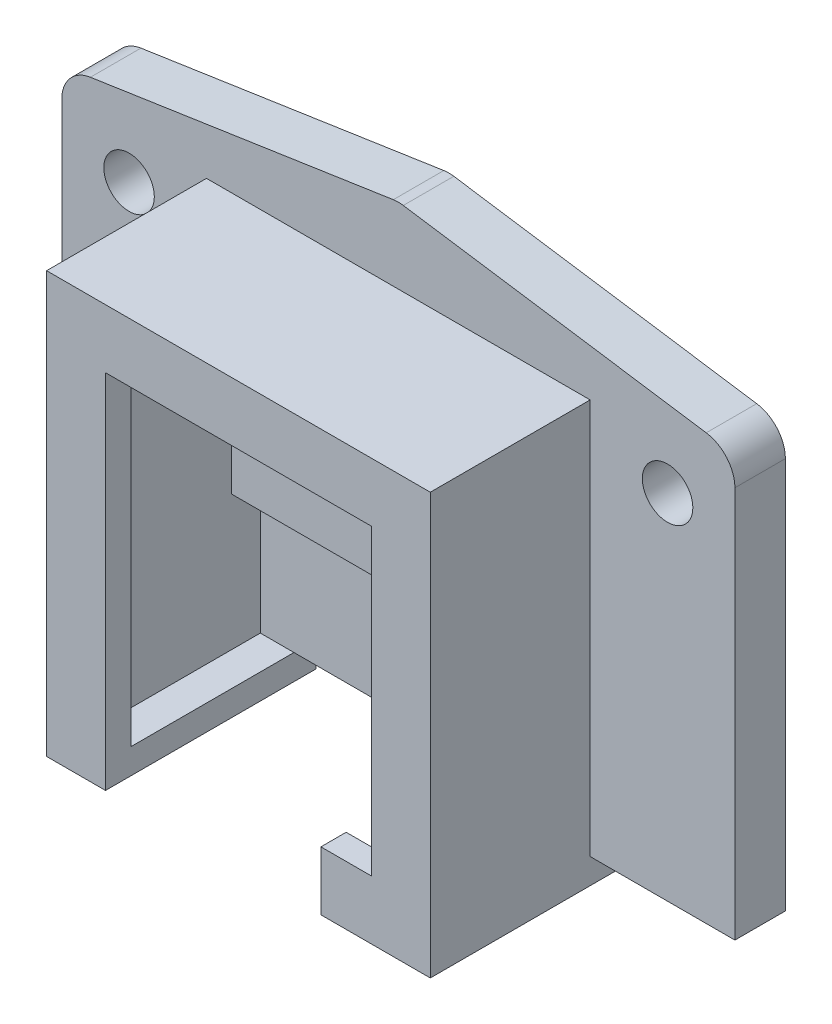
ISO-10303-21;
HEADER;
FILE_DESCRIPTION(('STEP AP214'),'2;1');
FILE_NAME('part.step','',(''),(''),'','','');
FILE_SCHEMA(('AUTOMOTIVE_DESIGN { 1 0 10303 214 1 1 1 1 }'));
ENDSEC;
DATA;
#1=APPLICATION_CONTEXT('core data for automotive mechanical design processes');
#2=APPLICATION_PROTOCOL_DEFINITION('international standard','automotive_design',2000,#1);
#3=PRODUCT_CONTEXT('',#1,'mechanical');
#4=PRODUCT('Part','Part','',(#3));
#5=PRODUCT_RELATED_PRODUCT_CATEGORY('part','',(#4));
#6=PRODUCT_DEFINITION_FORMATION('','',#4);
#7=PRODUCT_DEFINITION_CONTEXT('part definition',#1,'design');
#8=PRODUCT_DEFINITION('design','',#6,#7);
#9=PRODUCT_DEFINITION_SHAPE('','',#8);
#10=(LENGTH_UNIT() NAMED_UNIT(*) SI_UNIT(.MILLI.,.METRE.));
#11=(NAMED_UNIT(*) PLANE_ANGLE_UNIT() SI_UNIT($,.RADIAN.));
#12=(NAMED_UNIT(*) SI_UNIT($,.STERADIAN.) SOLID_ANGLE_UNIT());
#13=UNCERTAINTY_MEASURE_WITH_UNIT(LENGTH_MEASURE(1.E-05),#10,'distance_accuracy_value','');
#14=(GEOMETRIC_REPRESENTATION_CONTEXT(3) GLOBAL_UNCERTAINTY_ASSIGNED_CONTEXT((#13)) GLOBAL_UNIT_ASSIGNED_CONTEXT((#10,
#11,#12)) REPRESENTATION_CONTEXT('',''));
#15=CARTESIAN_POINT('',(0.,0.,0.));
#16=DIRECTION('',(0.,0.,1.));
#17=DIRECTION('',(1.,0.,0.));
#18=AXIS2_PLACEMENT_3D('',#15,#16,#17);
#19=CARTESIAN_POINT('',(-75.3066025977012,-5.31800766283525,3.));
#20=DIRECTION('',(0.,1.,0.));
#21=DIRECTION('',(0.,0.,1.));
#22=AXIS2_PLACEMENT_3D('',#19,#20,#21);
#23=PLANE('',#22);
#24=DIRECTION('',(0.,0.,1.));
#25=VECTOR('',#24,1.);
#26=CARTESIAN_POINT('',(-43.9066025977012,-5.31800766283525,11.));
#27=LINE('',#26,#25);
#28=CARTESIAN_POINT('',(-43.9066025977012,-5.31800766283525,0.));
#29=VERTEX_POINT('',#28);
#30=CARTESIAN_POINT('',(-43.9066025977012,-5.31800766283525,3.));
#31=VERTEX_POINT('',#30);
#32=EDGE_CURVE('E258',#29,#31,#27,.T.);
#33=ORIENTED_EDGE('',*,*,#32,.F.);
#34=DIRECTION('',(1.,0.,0.));
#35=VECTOR('',#34,1.);
#36=CARTESIAN_POINT('',(-75.3066025977012,-5.31800766283525,0.));
#37=LINE('',#36,#35);
#38=CARTESIAN_POINT('',(-35.3066025977012,-5.31800766283525,0.));
#39=VERTEX_POINT('',#38);
#40=EDGE_CURVE('E418',#29,#39,#37,.T.);
#41=ORIENTED_EDGE('',*,*,#40,.T.);
#42=DIRECTION('',(0.,0.,-1.));
#43=VECTOR('',#42,1.);
#44=CARTESIAN_POINT('',(-35.3066025977012,-5.31800766283525,3.));
#45=LINE('',#44,#43);
#46=CARTESIAN_POINT('',(-35.3066025977012,-5.31800766283525,3.));
#47=VERTEX_POINT('',#46);
#48=EDGE_CURVE('E424',#47,#39,#45,.T.);
#49=ORIENTED_EDGE('',*,*,#48,.F.);
#50=DIRECTION('',(1.,0.,0.));
#51=VECTOR('',#50,1.);
#52=CARTESIAN_POINT('',(-75.3066025977012,-5.31800766283525,3.));
#53=LINE('',#52,#51);
#54=EDGE_CURVE('E398',#31,#47,#53,.T.);
#55=ORIENTED_EDGE('',*,*,#54,.F.);
#56=EDGE_LOOP('',(#33,#41,#49,#55));
#57=FACE_BOUND('',#56,.T.);
#58=ADVANCED_FACE('F33',(#57),#23,.F.);
#59=DIRECTION('',(0.,0.,-1.));
#60=VECTOR('',#59,1.);
#61=CARTESIAN_POINT('',(-50.4066025977012,-5.31800766283525,11.));
#62=LINE('',#61,#60);
#63=CARTESIAN_POINT('',(-50.4066025977012,-5.31800766283525,3.));
#64=VERTEX_POINT('',#63);
#65=CARTESIAN_POINT('',(-50.4066025977012,-5.31800766283525,0.));
#66=VERTEX_POINT('',#65);
#67=EDGE_CURVE('E276',#64,#66,#62,.T.);
#68=ORIENTED_EDGE('',*,*,#67,.F.);
#69=CARTESIAN_POINT('',(-52.2066025977012,-5.31800766283525,3.));
#70=VERTEX_POINT('',#69);
#71=EDGE_CURVE('E403',#70,#64,#53,.T.);
#72=ORIENTED_EDGE('',*,*,#71,.F.);
#73=DIRECTION('',(0.,0.,1.));
#74=VECTOR('',#73,1.);
#75=CARTESIAN_POINT('',(-52.2066025977012,-5.31800766283525,3.));
#76=LINE('',#75,#74);
#77=CARTESIAN_POINT('',(-52.2066025977012,-5.31800766283525,1.3));
#78=VERTEX_POINT('',#77);
#79=EDGE_CURVE('E309',#78,#70,#76,.T.);
#80=ORIENTED_EDGE('',*,*,#79,.F.);
#81=DIRECTION('',(1.,0.,0.));
#82=VECTOR('',#81,1.);
#83=CARTESIAN_POINT('',(-65.2066025977012,-5.31800766283525,1.3));
#84=LINE('',#83,#82);
#85=CARTESIAN_POINT('',(-63.2066025977012,-5.31800766283525,1.3));
#86=VERTEX_POINT('',#85);
#87=EDGE_CURVE('E304',#86,#78,#84,.T.);
#88=ORIENTED_EDGE('',*,*,#87,.F.);
#89=DIRECTION('',(0.,0.,1.));
#90=VECTOR('',#89,1.);
#91=CARTESIAN_POINT('',(-63.2066025977012,-5.31800766283525,11.));
#92=LINE('',#91,#90);
#93=CARTESIAN_POINT('',(-63.2066025977012,-5.31800766283525,0.));
#94=VERTEX_POINT('',#93);
#95=EDGE_CURVE('E49',#94,#86,#92,.T.);
#96=ORIENTED_EDGE('',*,*,#95,.F.);
#97=EDGE_CURVE('E420',#94,#66,#37,.T.);
#98=ORIENTED_EDGE('',*,*,#97,.T.);
#99=EDGE_LOOP('',(#68,#72,#80,#88,#96,#98));
#100=FACE_BOUND('',#99,.T.);
#101=ADVANCED_FACE('F478',(#100),#23,.F.);
#102=DIRECTION('',(0.,0.,-1.));
#103=VECTOR('',#102,1.);
#104=CARTESIAN_POINT('',(-66.7066025977012,-5.31800766283525,11.));
#105=LINE('',#104,#103);
#106=CARTESIAN_POINT('',(-66.7066025977012,-5.31800766283525,3.));
#107=VERTEX_POINT('',#106);
#108=CARTESIAN_POINT('',(-66.7066025977012,-5.31800766283525,0.));
#109=VERTEX_POINT('',#108);
#110=EDGE_CURVE('E11',#107,#109,#105,.T.);
#111=ORIENTED_EDGE('',*,*,#110,.F.);
#112=CARTESIAN_POINT('',(-75.3066025977012,-5.31800766283525,3.));
#113=VERTEX_POINT('',#112);
#114=EDGE_CURVE('E399',#113,#107,#53,.T.);
#115=ORIENTED_EDGE('',*,*,#114,.F.);
#116=DIRECTION('',(0.,0.,-1.));
#117=VECTOR('',#116,1.);
#118=CARTESIAN_POINT('',(-75.3066025977012,-5.31800766283525,3.));
#119=LINE('',#118,#117);
#120=CARTESIAN_POINT('',(-75.3066025977012,-5.31800766283525,0.));
#121=VERTEX_POINT('',#120);
#122=EDGE_CURVE('E427',#113,#121,#119,.T.);
#123=ORIENTED_EDGE('',*,*,#122,.T.);
#124=EDGE_CURVE('E57',#121,#109,#37,.T.);
#125=ORIENTED_EDGE('',*,*,#124,.T.);
#126=EDGE_LOOP('',(#111,#115,#123,#125));
#127=FACE_BOUND('',#126,.T.);
#128=ADVANCED_FACE('F492',(#127),#23,.F.);
#129=CARTESIAN_POINT('',(-37.3066025977012,17.9596174955491,3.));
#130=DIRECTION('',(0.,0.,-1.));
#131=DIRECTION('',(-1.,0.,0.));
#132=AXIS2_PLACEMENT_3D('',#129,#130,#131);
#133=PLANE('',#132);
#134=CARTESIAN_POINT('',(-39.3066025977012,15.6819923371647,3.));
#135=DIRECTION('',(0.,0.,1.));
#136=DIRECTION('',(1.,0.,0.));
#137=AXIS2_PLACEMENT_3D('',#134,#135,#136);
#138=CIRCLE('',#137,1.5);
#139=CARTESIAN_POINT('',(-37.8066025977012,15.6819923371647,3.));
#140=VERTEX_POINT('',#139);
#141=EDGE_CURVE('E372',#140,#140,#138,.T.);
#142=ORIENTED_EDGE('',*,*,#141,.F.);
#143=EDGE_LOOP('',(#142));
#144=FACE_BOUND('',#143,.T.);
#145=CARTESIAN_POINT('',(-71.3066025977012,15.6819923371647,3.));
#146=DIRECTION('',(0.,0.,1.));
#147=DIRECTION('',(1.,0.,0.));
#148=AXIS2_PLACEMENT_3D('',#145,#146,#147);
#149=CIRCLE('',#148,1.5);
#150=CARTESIAN_POINT('',(-69.8066025977012,15.6819923371647,3.));
#151=VERTEX_POINT('',#150);
#152=EDGE_CURVE('E378',#151,#151,#149,.T.);
#153=ORIENTED_EDGE('',*,*,#152,.F.);
#154=EDGE_LOOP('',(#153));
#155=FACE_BOUND('',#154,.T.);
#156=DIRECTION('',(0.,-1.,0.));
#157=VECTOR('',#156,1.);
#158=CARTESIAN_POINT('',(-66.7066025977012,-5.31800766283525,3.));
#159=LINE('',#158,#157);
#160=CARTESIAN_POINT('',(-66.7066025977012,18.1819923371647,3.));
#161=VERTEX_POINT('',#160);
#162=EDGE_CURVE('E324',#161,#107,#159,.T.);
#163=ORIENTED_EDGE('',*,*,#162,.F.);
#164=DIRECTION('',(-1.,0.,0.));
#165=VECTOR('',#164,1.);
#166=CARTESIAN_POINT('',(-66.7066025977012,18.1819923371647,3.));
#167=LINE('',#166,#165);
#168=CARTESIAN_POINT('',(-43.9066025977012,18.1819923371647,3.));
#169=VERTEX_POINT('',#168);
#170=EDGE_CURVE('E334',#169,#161,#167,.T.);
#171=ORIENTED_EDGE('',*,*,#170,.F.);
#172=DIRECTION('',(0.,1.,0.));
#173=VECTOR('',#172,1.);
#174=CARTESIAN_POINT('',(-43.9066025977012,-5.31800766283525,3.));
#175=LINE('',#174,#173);
#176=EDGE_CURVE('E351',#31,#169,#175,.T.);
#177=ORIENTED_EDGE('',*,*,#176,.F.);
#178=ORIENTED_EDGE('',*,*,#54,.T.);
#179=DIRECTION('',(0.,1.,0.));
#180=VECTOR('',#179,1.);
#181=CARTESIAN_POINT('',(-35.3066025977012,17.9596174955491,3.));
#182=LINE('',#181,#180);
#183=CARTESIAN_POINT('',(-35.3066025977012,17.9596174955491,3.));
#184=VERTEX_POINT('',#183);
#185=EDGE_CURVE('E402',#47,#184,#182,.T.);
#186=ORIENTED_EDGE('',*,*,#185,.T.);
#187=CARTESIAN_POINT('',(-37.3066025977012,17.9596174955491,3.));
#188=DIRECTION('',(0.,0.,1.));
#189=DIRECTION('',(-1.,0.,0.));
#190=AXIS2_PLACEMENT_3D('',#187,#188,#189);
#191=CIRCLE('',#190,2.);
#192=CARTESIAN_POINT('',(-37.0099216918407,19.9374902012857,3.));
#193=VERTEX_POINT('',#192);
#194=EDGE_CURVE('E384',#184,#193,#191,.T.);
#195=ORIENTED_EDGE('',*,*,#194,.T.);
#196=DIRECTION('',(-0.988936352868298,0.148340452930245,0.));
#197=VECTOR('',#196,1.);
#198=CARTESIAN_POINT('',(-55.0099216918407,22.6374902012857,3.));
#199=LINE('',#198,#197);
#200=CARTESIAN_POINT('',(-55.0099216918407,22.6374902012857,3.));
#201=VERTEX_POINT('',#200);
#202=EDGE_CURVE('E387',#193,#201,#199,.T.);
#203=ORIENTED_EDGE('',*,*,#202,.T.);
#204=CARTESIAN_POINT('',(-55.3066025977012,20.6596174955491,3.));
#205=DIRECTION('',(0.,0.,1.));
#206=DIRECTION('',(-1.,0.,0.));
#207=AXIS2_PLACEMENT_3D('',#204,#205,#206);
#208=CIRCLE('',#207,2.);
#209=CARTESIAN_POINT('',(-55.6032835035617,22.6374902012857,3.));
#210=VERTEX_POINT('',#209);
#211=EDGE_CURVE('E390',#201,#210,#208,.T.);
#212=ORIENTED_EDGE('',*,*,#211,.T.);
#213=DIRECTION('',(-0.988936352868298,-0.148340452930245,0.));
#214=VECTOR('',#213,1.);
#215=CARTESIAN_POINT('',(-55.6032835035617,22.6374902012857,3.));
#216=LINE('',#215,#214);
#217=CARTESIAN_POINT('',(-73.6032835035616,19.9374902012857,3.));
#218=VERTEX_POINT('',#217);
#219=EDGE_CURVE('E392',#210,#218,#216,.T.);
#220=ORIENTED_EDGE('',*,*,#219,.T.);
#221=CARTESIAN_POINT('',(-73.3066025977012,17.9596174955491,3.));
#222=DIRECTION('',(0.,0.,1.));
#223=DIRECTION('',(1.,0.,0.));
#224=AXIS2_PLACEMENT_3D('',#221,#222,#223);
#225=CIRCLE('',#224,2.);
#226=CARTESIAN_POINT('',(-75.3066025977012,17.9596174955491,3.));
#227=VERTEX_POINT('',#226);
#228=EDGE_CURVE('E394',#218,#227,#225,.T.);
#229=ORIENTED_EDGE('',*,*,#228,.T.);
#230=DIRECTION('',(0.,-1.,0.));
#231=VECTOR('',#230,1.);
#232=CARTESIAN_POINT('',(-75.3066025977012,17.9596174955491,3.));
#233=LINE('',#232,#231);
#234=EDGE_CURVE('E396',#227,#113,#233,.T.);
#235=ORIENTED_EDGE('',*,*,#234,.T.);
#236=ORIENTED_EDGE('',*,*,#114,.T.);
#237=EDGE_LOOP('',(#163,#171,#177,#178,#186,#195,#203,#212,#220,#229,#235,#236));
#238=FACE_BOUND('',#237,.T.);
#239=ADVANCED_FACE('F466',(#144,#155,#238),#133,.F.);
#240=DIRECTION('',(-1.,0.,0.));
#241=VECTOR('',#240,1.);
#242=CARTESIAN_POINT('',(-65.2066025977012,2.68199233716475,3.));
#243=LINE('',#242,#241);
#244=CARTESIAN_POINT('',(-52.2066025977012,2.68199233716475,3.));
#245=VERTEX_POINT('',#244);
#246=CARTESIAN_POINT('',(-65.2066025977012,2.68199233716475,3.));
#247=VERTEX_POINT('',#246);
#248=EDGE_CURVE('E315',#245,#247,#243,.T.);
#249=ORIENTED_EDGE('',*,*,#248,.F.);
#250=DIRECTION('',(0.,-1.,0.));
#251=VECTOR('',#250,1.);
#252=CARTESIAN_POINT('',(-52.2066025977012,2.68199233716475,3.));
#253=LINE('',#252,#251);
#254=EDGE_CURVE('E321',#245,#70,#253,.T.);
#255=ORIENTED_EDGE('',*,*,#254,.T.);
#256=ORIENTED_EDGE('',*,*,#71,.T.);
#257=DIRECTION('',(1.,0.,0.));
#258=VECTOR('',#257,1.);
#259=CARTESIAN_POINT('',(-37.3066025977012,-5.31800766283525,3.));
#260=LINE('',#259,#258);
#261=CARTESIAN_POINT('',(-45.4066025977012,-5.31800766283525,3.));
#262=VERTEX_POINT('',#261);
#263=EDGE_CURVE('E283',#64,#262,#260,.T.);
#264=ORIENTED_EDGE('',*,*,#263,.T.);
#265=DIRECTION('',(0.,-1.,0.));
#266=VECTOR('',#265,1.);
#267=CARTESIAN_POINT('',(-45.4066025977012,16.6819923371647,3.));
#268=LINE('',#267,#266);
#269=CARTESIAN_POINT('',(-45.4066025977012,16.6819923371647,3.));
#270=VERTEX_POINT('',#269);
#271=EDGE_CURVE('E348',#270,#262,#268,.T.);
#272=ORIENTED_EDGE('',*,*,#271,.F.);
#273=DIRECTION('',(1.,0.,0.));
#274=VECTOR('',#273,1.);
#275=CARTESIAN_POINT('',(-65.2066025977012,16.6819923371647,3.));
#276=LINE('',#275,#274);
#277=CARTESIAN_POINT('',(-65.2066025977012,16.6819923371647,3.));
#278=VERTEX_POINT('',#277);
#279=EDGE_CURVE('E345',#278,#270,#276,.T.);
#280=ORIENTED_EDGE('',*,*,#279,.F.);
#281=DIRECTION('',(0.,1.,0.));
#282=VECTOR('',#281,1.);
#283=CARTESIAN_POINT('',(-65.2066025977012,16.6819923371647,3.));
#284=LINE('',#283,#282);
#285=EDGE_CURVE('E343',#247,#278,#284,.T.);
#286=ORIENTED_EDGE('',*,*,#285,.F.);
#287=EDGE_LOOP('',(#249,#255,#256,#264,#272,#280,#286));
#288=FACE_BOUND('',#287,.T.);
#289=ADVANCED_FACE('F517',(#288),#133,.F.);
#290=CARTESIAN_POINT('',(-37.3066025977012,17.9596174955491,0.));
#291=DIRECTION('',(0.,0.,-1.));
#292=DIRECTION('',(-1.,0.,0.));
#293=AXIS2_PLACEMENT_3D('',#290,#291,#292);
#294=PLANE('',#293);
#295=CARTESIAN_POINT('',(-71.3066025977012,15.6819923371647,0.));
#296=DIRECTION('',(0.,0.,1.));
#297=DIRECTION('',(1.,0.,0.));
#298=AXIS2_PLACEMENT_3D('',#295,#296,#297);
#299=CIRCLE('',#298,1.5);
#300=CARTESIAN_POINT('',(-69.8066025977012,15.6819923371647,0.));
#301=VERTEX_POINT('',#300);
#302=EDGE_CURVE('E375',#301,#301,#299,.T.);
#303=ORIENTED_EDGE('',*,*,#302,.T.);
#304=EDGE_LOOP('',(#303));
#305=FACE_BOUND('',#304,.T.);
#306=CARTESIAN_POINT('',(-37.3066025977012,17.9596174955491,0.));
#307=DIRECTION('',(0.,0.,1.));
#308=DIRECTION('',(-1.,0.,0.));
#309=AXIS2_PLACEMENT_3D('',#306,#307,#308);
#310=CIRCLE('',#309,2.);
#311=CARTESIAN_POINT('',(-35.3066025977012,17.9596174955491,0.));
#312=VERTEX_POINT('',#311);
#313=CARTESIAN_POINT('',(-37.0099216918407,19.9374902012857,0.));
#314=VERTEX_POINT('',#313);
#315=EDGE_CURVE('E381',#312,#314,#310,.T.);
#316=ORIENTED_EDGE('',*,*,#315,.F.);
#317=DIRECTION('',(0.,1.,0.));
#318=VECTOR('',#317,1.);
#319=CARTESIAN_POINT('',(-35.3066025977012,17.9596174955491,0.));
#320=LINE('',#319,#318);
#321=EDGE_CURVE('E388',#39,#312,#320,.T.);
#322=ORIENTED_EDGE('',*,*,#321,.F.);
#323=ORIENTED_EDGE('',*,*,#40,.F.);
#324=DIRECTION('',(0.,1.,0.));
#325=VECTOR('',#324,1.);
#326=CARTESIAN_POINT('',(-43.9066025977012,-6.81800766283525,0.));
#327=LINE('',#326,#325);
#328=CARTESIAN_POINT('',(-43.9066025977012,-6.81800766283525,0.));
#329=VERTEX_POINT('',#328);
#330=EDGE_CURVE('E272',#329,#29,#327,.T.);
#331=ORIENTED_EDGE('',*,*,#330,.F.);
#332=DIRECTION('',(1.,0.,0.));
#333=VECTOR('',#332,1.);
#334=CARTESIAN_POINT('',(-43.9066025977012,-6.81800766283525,0.));
#335=LINE('',#334,#333);
#336=CARTESIAN_POINT('',(-50.4066025977012,-6.81800766283525,0.));
#337=VERTEX_POINT('',#336);
#338=EDGE_CURVE('E271',#337,#329,#335,.T.);
#339=ORIENTED_EDGE('',*,*,#338,.F.);
#340=DIRECTION('',(0.,1.,0.));
#341=VECTOR('',#340,1.);
#342=CARTESIAN_POINT('',(-50.4066025977012,-6.81800766283525,0.));
#343=LINE('',#342,#341);
#344=EDGE_CURVE('E280',#337,#66,#343,.T.);
#345=ORIENTED_EDGE('',*,*,#344,.T.);
#346=ORIENTED_EDGE('',*,*,#97,.F.);
#347=DIRECTION('',(0.,1.,0.));
#348=VECTOR('',#347,1.);
#349=CARTESIAN_POINT('',(-63.2066025977012,-6.81800766283525,0.));
#350=LINE('',#349,#348);
#351=CARTESIAN_POINT('',(-63.2066025977012,-6.81800766283525,0.));
#352=VERTEX_POINT('',#351);
#353=EDGE_CURVE('E294',#352,#94,#350,.T.);
#354=ORIENTED_EDGE('',*,*,#353,.F.);
#355=DIRECTION('',(1.,0.,0.));
#356=VECTOR('',#355,1.);
#357=CARTESIAN_POINT('',(-66.7066025977012,-6.81800766283525,0.));
#358=LINE('',#357,#356);
#359=CARTESIAN_POINT('',(-66.7066025977012,-6.81800766283525,0.));
#360=VERTEX_POINT('',#359);
#361=EDGE_CURVE('E290',#360,#352,#358,.T.);
#362=ORIENTED_EDGE('',*,*,#361,.F.);
#363=DIRECTION('',(0.,1.,0.));
#364=VECTOR('',#363,1.);
#365=CARTESIAN_POINT('',(-66.7066025977012,-6.81800766283525,0.));
#366=LINE('',#365,#364);
#367=EDGE_CURVE('E301',#360,#109,#366,.T.);
#368=ORIENTED_EDGE('',*,*,#367,.T.);
#369=ORIENTED_EDGE('',*,*,#124,.F.);
#370=DIRECTION('',(0.,-1.,0.));
#371=VECTOR('',#370,1.);
#372=CARTESIAN_POINT('',(-75.3066025977012,17.9596174955491,0.));
#373=LINE('',#372,#371);
#374=CARTESIAN_POINT('',(-75.3066025977012,17.9596174955491,0.));
#375=VERTEX_POINT('',#374);
#376=EDGE_CURVE('E416',#375,#121,#373,.T.);
#377=ORIENTED_EDGE('',*,*,#376,.F.);
#378=CARTESIAN_POINT('',(-73.3066025977012,17.9596174955491,0.));
#379=DIRECTION('',(0.,0.,1.));
#380=DIRECTION('',(1.,0.,0.));
#381=AXIS2_PLACEMENT_3D('',#378,#379,#380);
#382=CIRCLE('',#381,2.);
#383=CARTESIAN_POINT('',(-73.6032835035616,19.9374902012857,0.));
#384=VERTEX_POINT('',#383);
#385=EDGE_CURVE('E414',#384,#375,#382,.T.);
#386=ORIENTED_EDGE('',*,*,#385,.F.);
#387=DIRECTION('',(-0.988936352868298,-0.148340452930245,0.));
#388=VECTOR('',#387,1.);
#389=CARTESIAN_POINT('',(-55.6032835035617,22.6374902012857,0.));
#390=LINE('',#389,#388);
#391=CARTESIAN_POINT('',(-55.6032835035617,22.6374902012857,0.));
#392=VERTEX_POINT('',#391);
#393=EDGE_CURVE('E412',#392,#384,#390,.T.);
#394=ORIENTED_EDGE('',*,*,#393,.F.);
#395=CARTESIAN_POINT('',(-55.3066025977012,20.6596174955491,0.));
#396=DIRECTION('',(0.,0.,1.));
#397=DIRECTION('',(-1.,0.,0.));
#398=AXIS2_PLACEMENT_3D('',#395,#396,#397);
#399=CIRCLE('',#398,2.);
#400=CARTESIAN_POINT('',(-55.0099216918407,22.6374902012857,0.));
#401=VERTEX_POINT('',#400);
#402=EDGE_CURVE('E410',#401,#392,#399,.T.);
#403=ORIENTED_EDGE('',*,*,#402,.F.);
#404=DIRECTION('',(-0.988936352868298,0.148340452930245,0.));
#405=VECTOR('',#404,1.);
#406=CARTESIAN_POINT('',(-55.0099216918407,22.6374902012857,0.));
#407=LINE('',#406,#405);
#408=EDGE_CURVE('E408',#314,#401,#407,.T.);
#409=ORIENTED_EDGE('',*,*,#408,.F.);
#410=EDGE_LOOP('',(#316,#322,#323,#331,#339,#345,#346,#354,#362,#368,#369,#377,#386,#394,#403,#409));
#411=FACE_BOUND('',#410,.T.);
#412=CARTESIAN_POINT('',(-39.3066025977012,15.6819923371647,0.));
#413=DIRECTION('',(0.,0.,1.));
#414=DIRECTION('',(1.,0.,0.));
#415=AXIS2_PLACEMENT_3D('',#412,#413,#414);
#416=CIRCLE('',#415,1.5);
#417=CARTESIAN_POINT('',(-37.8066025977012,15.6819923371647,0.));
#418=VERTEX_POINT('',#417);
#419=EDGE_CURVE('E371',#418,#418,#416,.T.);
#420=ORIENTED_EDGE('',*,*,#419,.T.);
#421=EDGE_LOOP('',(#420));
#422=FACE_BOUND('',#421,.T.);
#423=ADVANCED_FACE('F453',(#305,#411,#422),#294,.T.);
#424=CARTESIAN_POINT('',(-37.3066025977012,17.9596174955491,3.));
#425=DIRECTION('',(0.,0.,-1.));
#426=DIRECTION('',(-1.,0.,0.));
#427=AXIS2_PLACEMENT_3D('',#424,#425,#426);
#428=CYLINDRICAL_SURFACE('',#427,2.);
#429=ORIENTED_EDGE('',*,*,#315,.T.);
#430=DIRECTION('',(0.,0.,-1.));
#431=VECTOR('',#430,1.);
#432=CARTESIAN_POINT('',(-37.0099216918407,19.9374902012857,3.));
#433=LINE('',#432,#431);
#434=EDGE_CURVE('E37',#193,#314,#433,.T.);
#435=ORIENTED_EDGE('',*,*,#434,.F.);
#436=ORIENTED_EDGE('',*,*,#194,.F.);
#437=DIRECTION('',(0.,0.,-1.));
#438=VECTOR('',#437,1.);
#439=CARTESIAN_POINT('',(-35.3066025977012,17.9596174955491,3.));
#440=LINE('',#439,#438);
#441=EDGE_CURVE('E405',#184,#312,#440,.T.);
#442=ORIENTED_EDGE('',*,*,#441,.T.);
#443=EDGE_LOOP('',(#429,#435,#436,#442));
#444=FACE_BOUND('',#443,.T.);
#445=ADVANCED_FACE('F35',(#444),#428,.T.);
#446=CARTESIAN_POINT('',(-55.0099216918407,22.6374902012857,3.));
#447=DIRECTION('',(-0.148340452930245,-0.988936352868298,0.));
#448=DIRECTION('',(0.988936352868298,-0.148340452930245,0.));
#449=AXIS2_PLACEMENT_3D('',#446,#447,#448);
#450=PLANE('',#449);
#451=ORIENTED_EDGE('',*,*,#408,.T.);
#452=DIRECTION('',(0.,0.,-1.));
#453=VECTOR('',#452,1.);
#454=CARTESIAN_POINT('',(-55.0099216918407,22.6374902012857,3.));
#455=LINE('',#454,#453);
#456=EDGE_CURVE('E437',#201,#401,#455,.T.);
#457=ORIENTED_EDGE('',*,*,#456,.F.);
#458=ORIENTED_EDGE('',*,*,#202,.F.);
#459=ORIENTED_EDGE('',*,*,#434,.T.);
#460=EDGE_LOOP('',(#451,#457,#458,#459));
#461=FACE_BOUND('',#460,.T.);
#462=ADVANCED_FACE('F446',(#461),#450,.F.);
#463=CARTESIAN_POINT('',(-55.3066025977012,20.6596174955491,3.));
#464=DIRECTION('',(0.,0.,-1.));
#465=DIRECTION('',(-1.,0.,0.));
#466=AXIS2_PLACEMENT_3D('',#463,#464,#465);
#467=CYLINDRICAL_SURFACE('',#466,2.);
#468=ORIENTED_EDGE('',*,*,#402,.T.);
#469=DIRECTION('',(0.,0.,-1.));
#470=VECTOR('',#469,1.);
#471=CARTESIAN_POINT('',(-55.6032835035617,22.6374902012857,3.));
#472=LINE('',#471,#470);
#473=EDGE_CURVE('E435',#210,#392,#472,.T.);
#474=ORIENTED_EDGE('',*,*,#473,.F.);
#475=ORIENTED_EDGE('',*,*,#211,.F.);
#476=ORIENTED_EDGE('',*,*,#456,.T.);
#477=EDGE_LOOP('',(#468,#474,#475,#476));
#478=FACE_BOUND('',#477,.T.);
#479=ADVANCED_FACE('F459',(#478),#467,.T.);
#480=CARTESIAN_POINT('',(-55.6032835035617,22.6374902012857,3.));
#481=DIRECTION('',(0.148340452930245,-0.988936352868298,0.));
#482=DIRECTION('',(0.988936352868298,0.148340452930245,0.));
#483=AXIS2_PLACEMENT_3D('',#480,#481,#482);
#484=PLANE('',#483);
#485=ORIENTED_EDGE('',*,*,#393,.T.);
#486=DIRECTION('',(0.,0.,-1.));
#487=VECTOR('',#486,1.);
#488=CARTESIAN_POINT('',(-73.6032835035616,19.9374902012857,3.));
#489=LINE('',#488,#487);
#490=EDGE_CURVE('E432',#218,#384,#489,.T.);
#491=ORIENTED_EDGE('',*,*,#490,.F.);
#492=ORIENTED_EDGE('',*,*,#219,.F.);
#493=ORIENTED_EDGE('',*,*,#473,.T.);
#494=EDGE_LOOP('',(#485,#491,#492,#493));
#495=FACE_BOUND('',#494,.T.);
#496=ADVANCED_FACE('F462',(#495),#484,.F.);
#497=CARTESIAN_POINT('',(-73.3066025977012,17.9596174955491,3.));
#498=DIRECTION('',(0.,0.,-1.));
#499=DIRECTION('',(-1.,0.,0.));
#500=AXIS2_PLACEMENT_3D('',#497,#498,#499);
#501=CYLINDRICAL_SURFACE('',#500,2.);
#502=ORIENTED_EDGE('',*,*,#385,.T.);
#503=DIRECTION('',(0.,0.,-1.));
#504=VECTOR('',#503,1.);
#505=CARTESIAN_POINT('',(-75.3066025977012,17.9596174955491,3.));
#506=LINE('',#505,#504);
#507=EDGE_CURVE('E429',#227,#375,#506,.T.);
#508=ORIENTED_EDGE('',*,*,#507,.F.);
#509=ORIENTED_EDGE('',*,*,#228,.F.);
#510=ORIENTED_EDGE('',*,*,#490,.T.);
#511=EDGE_LOOP('',(#502,#508,#509,#510));
#512=FACE_BOUND('',#511,.T.);
#513=ADVANCED_FACE('F498',(#512),#501,.T.);
#514=CARTESIAN_POINT('',(-75.3066025977012,17.9596174955491,3.));
#515=DIRECTION('',(1.,0.,0.));
#516=DIRECTION('',(0.,1.,0.));
#517=AXIS2_PLACEMENT_3D('',#514,#515,#516);
#518=PLANE('',#517);
#519=ORIENTED_EDGE('',*,*,#376,.T.);
#520=ORIENTED_EDGE('',*,*,#122,.F.);
#521=ORIENTED_EDGE('',*,*,#234,.F.);
#522=ORIENTED_EDGE('',*,*,#507,.T.);
#523=EDGE_LOOP('',(#519,#520,#521,#522));
#524=FACE_BOUND('',#523,.T.);
#525=ADVANCED_FACE('F496',(#524),#518,.F.);
#526=CARTESIAN_POINT('',(-35.3066025977012,17.9596174955491,3.));
#527=DIRECTION('',(-1.,0.,0.));
#528=DIRECTION('',(0.,0.,1.));
#529=AXIS2_PLACEMENT_3D('',#526,#527,#528);
#530=PLANE('',#529);
#531=ORIENTED_EDGE('',*,*,#321,.T.);
#532=ORIENTED_EDGE('',*,*,#441,.F.);
#533=ORIENTED_EDGE('',*,*,#185,.F.);
#534=ORIENTED_EDGE('',*,*,#48,.T.);
#535=EDGE_LOOP('',(#531,#532,#533,#534));
#536=FACE_BOUND('',#535,.T.);
#537=ADVANCED_FACE('F473',(#536),#530,.F.);
#538=CARTESIAN_POINT('',(-71.3066025977012,15.6819923371647,3.));
#539=DIRECTION('',(0.,0.,-1.));
#540=DIRECTION('',(-1.,0.,0.));
#541=AXIS2_PLACEMENT_3D('',#538,#539,#540);
#542=CYLINDRICAL_SURFACE('',#541,1.5);
#543=ORIENTED_EDGE('',*,*,#152,.T.);
#544=EDGE_LOOP('',(#543));
#545=FACE_BOUND('',#544,.T.);
#546=ORIENTED_EDGE('',*,*,#302,.F.);
#547=EDGE_LOOP('',(#546));
#548=FACE_BOUND('',#547,.T.);
#549=ADVANCED_FACE('F528',(#545,#548),#542,.F.);
#550=CARTESIAN_POINT('',(-39.3066025977012,15.6819923371647,3.));
#551=DIRECTION('',(0.,0.,-1.));
#552=DIRECTION('',(-1.,0.,0.));
#553=AXIS2_PLACEMENT_3D('',#550,#551,#552);
#554=CYLINDRICAL_SURFACE('',#553,1.5);
#555=ORIENTED_EDGE('',*,*,#141,.T.);
#556=EDGE_LOOP('',(#555));
#557=FACE_BOUND('',#556,.T.);
#558=ORIENTED_EDGE('',*,*,#419,.F.);
#559=EDGE_LOOP('',(#558));
#560=FACE_BOUND('',#559,.T.);
#561=ADVANCED_FACE('F536',(#557,#560),#554,.F.);
#562=CARTESIAN_POINT('',(-66.7066025977012,-5.31800766283525,11.));
#563=DIRECTION('',(1.,0.,0.));
#564=DIRECTION('',(0.,0.,-1.));
#565=AXIS2_PLACEMENT_3D('',#562,#563,#564);
#566=PLANE('',#565);
#567=ORIENTED_EDGE('',*,*,#162,.T.);
#568=ORIENTED_EDGE('',*,*,#110,.T.);
#569=ORIENTED_EDGE('',*,*,#367,.F.);
#570=DIRECTION('',(0.,0.,-1.));
#571=VECTOR('',#570,1.);
#572=CARTESIAN_POINT('',(-66.7066025977012,-6.81800766283525,11.));
#573=LINE('',#572,#571);
#574=CARTESIAN_POINT('',(-66.7066025977012,-6.81800766283525,12.5));
#575=VERTEX_POINT('',#574);
#576=EDGE_CURVE('E287',#575,#360,#573,.T.);
#577=ORIENTED_EDGE('',*,*,#576,.F.);
#578=DIRECTION('',(0.,-1.,0.));
#579=VECTOR('',#578,1.);
#580=CARTESIAN_POINT('',(-66.7066025977012,-6.81800766283525,12.5));
#581=LINE('',#580,#579);
#582=CARTESIAN_POINT('',(-66.7066025977012,18.1819923371647,12.5));
#583=VERTEX_POINT('',#582);
#584=EDGE_CURVE('E899',#583,#575,#581,.T.);
#585=ORIENTED_EDGE('',*,*,#584,.F.);
#586=DIRECTION('',(0.,0.,-1.));
#587=VECTOR('',#586,1.);
#588=CARTESIAN_POINT('',(-66.7066025977012,18.1819923371647,11.));
#589=LINE('',#588,#587);
#590=EDGE_CURVE('E340',#583,#161,#589,.T.);
#591=ORIENTED_EDGE('',*,*,#590,.T.);
#592=EDGE_LOOP('',(#567,#568,#569,#577,#585,#591));
#593=FACE_BOUND('',#592,.T.);
#594=ADVANCED_FACE('F489',(#593),#566,.F.);
#595=CARTESIAN_POINT('',(-65.2066025977012,16.6819923371647,11.));
#596=DIRECTION('',(-1.,0.,0.));
#597=DIRECTION('',(0.,0.,1.));
#598=AXIS2_PLACEMENT_3D('',#595,#596,#597);
#599=PLANE('',#598);
#600=DIRECTION('',(0.,0.,-1.));
#601=VECTOR('',#600,1.);
#602=CARTESIAN_POINT('',(-65.2066025977012,-5.31800766283525,11.));
#603=LINE('',#602,#601);
#604=CARTESIAN_POINT('',(-65.2066025977012,-5.31800766283525,11.));
#605=VERTEX_POINT('',#604);
#606=CARTESIAN_POINT('',(-65.2066025977012,-5.31800766283525,1.3));
#607=VERTEX_POINT('',#606);
#608=EDGE_CURVE('E369',#605,#607,#603,.T.);
#609=ORIENTED_EDGE('',*,*,#608,.T.);
#610=DIRECTION('',(0.,-1.,0.));
#611=VECTOR('',#610,1.);
#612=CARTESIAN_POINT('',(-65.2066025977012,2.68199233716475,1.3));
#613=LINE('',#612,#611);
#614=CARTESIAN_POINT('',(-65.2066025977012,2.68199233716475,1.3));
#615=VERTEX_POINT('',#614);
#616=EDGE_CURVE('E317',#615,#607,#613,.T.);
#617=ORIENTED_EDGE('',*,*,#616,.F.);
#618=DIRECTION('',(0.,0.,-1.));
#619=VECTOR('',#618,1.);
#620=CARTESIAN_POINT('',(-65.2066025977012,2.68199233716475,3.));
#621=LINE('',#620,#619);
#622=EDGE_CURVE('E305',#247,#615,#621,.T.);
#623=ORIENTED_EDGE('',*,*,#622,.F.);
#624=ORIENTED_EDGE('',*,*,#285,.T.);
#625=DIRECTION('',(0.,0.,-1.));
#626=VECTOR('',#625,1.);
#627=CARTESIAN_POINT('',(-65.2066025977012,16.6819923371647,11.));
#628=LINE('',#627,#626);
#629=CARTESIAN_POINT('',(-65.2066025977012,16.6819923371647,11.));
#630=VERTEX_POINT('',#629);
#631=EDGE_CURVE('E366',#630,#278,#628,.T.);
#632=ORIENTED_EDGE('',*,*,#631,.F.);
#633=DIRECTION('',(0.,1.,0.));
#634=VECTOR('',#633,1.);
#635=CARTESIAN_POINT('',(-65.2066025977012,16.6819923371647,11.));
#636=LINE('',#635,#634);
#637=EDGE_CURVE('E330',#605,#630,#636,.T.);
#638=ORIENTED_EDGE('',*,*,#637,.F.);
#639=EDGE_LOOP('',(#609,#617,#623,#624,#632,#638));
#640=FACE_BOUND('',#639,.T.);
#641=ADVANCED_FACE('F548',(#640),#599,.F.);
#642=CARTESIAN_POINT('',(-65.2066025977012,16.6819923371647,11.));
#643=DIRECTION('',(0.,1.,0.));
#644=DIRECTION('',(0.,0.,1.));
#645=AXIS2_PLACEMENT_3D('',#642,#643,#644);
#646=PLANE('',#645);
#647=ORIENTED_EDGE('',*,*,#279,.T.);
#648=DIRECTION('',(0.,0.,-1.));
#649=VECTOR('',#648,1.);
#650=CARTESIAN_POINT('',(-45.4066025977012,16.6819923371647,11.));
#651=LINE('',#650,#649);
#652=CARTESIAN_POINT('',(-45.4066025977012,16.6819923371647,11.));
#653=VERTEX_POINT('',#652);
#654=EDGE_CURVE('E363',#653,#270,#651,.T.);
#655=ORIENTED_EDGE('',*,*,#654,.F.);
#656=DIRECTION('',(1.,0.,0.));
#657=VECTOR('',#656,1.);
#658=CARTESIAN_POINT('',(-65.2066025977012,16.6819923371647,11.));
#659=LINE('',#658,#657);
#660=EDGE_CURVE('E333',#630,#653,#659,.T.);
#661=ORIENTED_EDGE('',*,*,#660,.F.);
#662=ORIENTED_EDGE('',*,*,#631,.T.);
#663=EDGE_LOOP('',(#647,#655,#661,#662));
#664=FACE_BOUND('',#663,.T.);
#665=ADVANCED_FACE('F554',(#664),#646,.F.);
#666=CARTESIAN_POINT('',(-45.4066025977012,16.6819923371647,11.));
#667=DIRECTION('',(1.,0.,0.));
#668=DIRECTION('',(0.,0.,-1.));
#669=AXIS2_PLACEMENT_3D('',#666,#667,#668);
#670=PLANE('',#669);
#671=ORIENTED_EDGE('',*,*,#271,.T.);
#672=DIRECTION('',(0.,0.,-1.));
#673=VECTOR('',#672,1.);
#674=CARTESIAN_POINT('',(-45.4066025977012,-5.31800766283525,11.));
#675=LINE('',#674,#673);
#676=CARTESIAN_POINT('',(-45.4066025977012,-5.31800766283525,11.));
#677=VERTEX_POINT('',#676);
#678=EDGE_CURVE('E361',#677,#262,#675,.T.);
#679=ORIENTED_EDGE('',*,*,#678,.F.);
#680=DIRECTION('',(0.,-1.,0.));
#681=VECTOR('',#680,1.);
#682=CARTESIAN_POINT('',(-45.4066025977012,16.6819923371647,11.));
#683=LINE('',#682,#681);
#684=EDGE_CURVE('E337',#653,#677,#683,.T.);
#685=ORIENTED_EDGE('',*,*,#684,.F.);
#686=ORIENTED_EDGE('',*,*,#654,.T.);
#687=EDGE_LOOP('',(#671,#679,#685,#686));
#688=FACE_BOUND('',#687,.T.);
#689=ADVANCED_FACE('F558',(#688),#670,.F.);
#690=CARTESIAN_POINT('',(-43.9066025977012,-5.31800766283525,11.));
#691=DIRECTION('',(-1.,0.,0.));
#692=DIRECTION('',(0.,-1.,0.));
#693=AXIS2_PLACEMENT_3D('',#690,#691,#692);
#694=PLANE('',#693);
#695=ORIENTED_EDGE('',*,*,#176,.T.);
#696=DIRECTION('',(0.,0.,-1.));
#697=VECTOR('',#696,1.);
#698=CARTESIAN_POINT('',(-43.9066025977012,18.1819923371647,11.));
#699=LINE('',#698,#697);
#700=CARTESIAN_POINT('',(-43.9066025977012,18.1819923371647,12.5));
#701=VERTEX_POINT('',#700);
#702=EDGE_CURVE('E358',#701,#169,#699,.T.);
#703=ORIENTED_EDGE('',*,*,#702,.F.);
#704=DIRECTION('',(0.,1.,0.));
#705=VECTOR('',#704,1.);
#706=CARTESIAN_POINT('',(-43.9066025977012,18.1819923371647,12.5));
#707=LINE('',#706,#705);
#708=CARTESIAN_POINT('',(-43.9066025977012,-6.81800766283525,12.5));
#709=VERTEX_POINT('',#708);
#710=EDGE_CURVE('E904',#709,#701,#707,.T.);
#711=ORIENTED_EDGE('',*,*,#710,.F.);
#712=DIRECTION('',(0.,0.,1.));
#713=VECTOR('',#712,1.);
#714=CARTESIAN_POINT('',(-43.9066025977012,-6.81800766283525,11.));
#715=LINE('',#714,#713);
#716=EDGE_CURVE('E266',#329,#709,#715,.T.);
#717=ORIENTED_EDGE('',*,*,#716,.F.);
#718=ORIENTED_EDGE('',*,*,#330,.T.);
#719=ORIENTED_EDGE('',*,*,#32,.T.);
#720=EDGE_LOOP('',(#695,#703,#711,#717,#718,#719));
#721=FACE_BOUND('',#720,.T.);
#722=ADVANCED_FACE('F562',(#721),#694,.F.);
#723=CARTESIAN_POINT('',(-66.7066025977012,18.1819923371647,11.));
#724=DIRECTION('',(0.,-1.,0.));
#725=DIRECTION('',(1.,0.,0.));
#726=AXIS2_PLACEMENT_3D('',#723,#724,#725);
#727=PLANE('',#726);
#728=ORIENTED_EDGE('',*,*,#170,.T.);
#729=ORIENTED_EDGE('',*,*,#590,.F.);
#730=DIRECTION('',(-1.,0.,0.));
#731=VECTOR('',#730,1.);
#732=CARTESIAN_POINT('',(-66.7066025977012,18.1819923371647,12.5));
#733=LINE('',#732,#731);
#734=EDGE_CURVE('E901',#701,#583,#733,.T.);
#735=ORIENTED_EDGE('',*,*,#734,.F.);
#736=ORIENTED_EDGE('',*,*,#702,.T.);
#737=EDGE_LOOP('',(#728,#729,#735,#736));
#738=FACE_BOUND('',#737,.T.);
#739=ADVANCED_FACE('F566',(#738),#727,.F.);
#740=CARTESIAN_POINT('',(-52.2066025977012,2.68199233716475,3.));
#741=DIRECTION('',(1.,0.,0.));
#742=DIRECTION('',(0.,0.,-1.));
#743=AXIS2_PLACEMENT_3D('',#740,#741,#742);
#744=PLANE('',#743);
#745=ORIENTED_EDGE('',*,*,#79,.T.);
#746=ORIENTED_EDGE('',*,*,#254,.F.);
#747=DIRECTION('',(0.,0.,1.));
#748=VECTOR('',#747,1.);
#749=CARTESIAN_POINT('',(-52.2066025977012,2.68199233716475,3.));
#750=LINE('',#749,#748);
#751=CARTESIAN_POINT('',(-52.2066025977012,2.68199233716475,1.3));
#752=VERTEX_POINT('',#751);
#753=EDGE_CURVE('E312',#752,#245,#750,.T.);
#754=ORIENTED_EDGE('',*,*,#753,.F.);
#755=DIRECTION('',(0.,-1.,0.));
#756=VECTOR('',#755,1.);
#757=CARTESIAN_POINT('',(-52.2066025977012,2.68199233716475,1.3));
#758=LINE('',#757,#756);
#759=EDGE_CURVE('E325',#752,#78,#758,.T.);
#760=ORIENTED_EDGE('',*,*,#759,.T.);
#761=EDGE_LOOP('',(#745,#746,#754,#760));
#762=FACE_BOUND('',#761,.T.);
#763=ADVANCED_FACE('F570',(#762),#744,.F.);
#764=CARTESIAN_POINT('',(-65.2066025977012,2.68199233716475,1.3));
#765=DIRECTION('',(0.,0.,-1.));
#766=DIRECTION('',(-1.,0.,0.));
#767=AXIS2_PLACEMENT_3D('',#764,#765,#766);
#768=PLANE('',#767);
#769=EDGE_CURVE('E318',#607,#86,#84,.T.);
#770=ORIENTED_EDGE('',*,*,#769,.T.);
#771=ORIENTED_EDGE('',*,*,#87,.T.);
#772=ORIENTED_EDGE('',*,*,#759,.F.);
#773=DIRECTION('',(1.,0.,0.));
#774=VECTOR('',#773,1.);
#775=CARTESIAN_POINT('',(-65.2066025977012,2.68199233716475,1.3));
#776=LINE('',#775,#774);
#777=EDGE_CURVE('E308',#615,#752,#776,.T.);
#778=ORIENTED_EDGE('',*,*,#777,.F.);
#779=ORIENTED_EDGE('',*,*,#616,.T.);
#780=EDGE_LOOP('',(#770,#771,#772,#778,#779));
#781=FACE_BOUND('',#780,.T.);
#782=ADVANCED_FACE('F572',(#781),#768,.F.);
#783=CARTESIAN_POINT('',(0.,2.68199233716475,0.));
#784=DIRECTION('',(0.,-1.,0.));
#785=DIRECTION('',(0.,0.,-1.));
#786=AXIS2_PLACEMENT_3D('',#783,#784,#785);
#787=PLANE('',#786);
#788=ORIENTED_EDGE('',*,*,#622,.T.);
#789=ORIENTED_EDGE('',*,*,#777,.T.);
#790=ORIENTED_EDGE('',*,*,#753,.T.);
#791=ORIENTED_EDGE('',*,*,#248,.T.);
#792=EDGE_LOOP('',(#788,#789,#790,#791));
#793=FACE_BOUND('',#792,.T.);
#794=ADVANCED_FACE('F575',(#793),#787,.T.);
#795=CARTESIAN_POINT('',(-63.2066025977012,-6.81800766283525,11.));
#796=DIRECTION('',(-1.,0.,0.));
#797=DIRECTION('',(0.,0.,1.));
#798=AXIS2_PLACEMENT_3D('',#795,#796,#797);
#799=PLANE('',#798);
#800=ORIENTED_EDGE('',*,*,#95,.T.);
#801=CARTESIAN_POINT('',(-63.2066025977012,-5.31800766283525,11.));
#802=VERTEX_POINT('',#801);
#803=EDGE_CURVE('E286',#86,#802,#92,.T.);
#804=ORIENTED_EDGE('',*,*,#803,.T.);
#805=DIRECTION('',(0.,1.,0.));
#806=VECTOR('',#805,1.);
#807=CARTESIAN_POINT('',(-63.2066025977012,-5.31800766283525,11.));
#808=LINE('',#807,#806);
#809=CARTESIAN_POINT('',(-63.2066025977012,14.6819923371647,11.));
#810=VERTEX_POINT('',#809);
#811=EDGE_CURVE('E253',#802,#810,#808,.T.);
#812=ORIENTED_EDGE('',*,*,#811,.T.);
#813=DIRECTION('',(0.,0.,-1.));
#814=VECTOR('',#813,1.);
#815=CARTESIAN_POINT('',(-63.2066025977012,14.6819923371647,12.5));
#816=LINE('',#815,#814);
#817=CARTESIAN_POINT('',(-63.2066025977012,14.6819923371647,12.5));
#818=VERTEX_POINT('',#817);
#819=EDGE_CURVE('E237',#818,#810,#816,.T.);
#820=ORIENTED_EDGE('',*,*,#819,.F.);
#821=DIRECTION('',(0.,1.,0.));
#822=VECTOR('',#821,1.);
#823=CARTESIAN_POINT('',(-63.2066025977012,14.6819923371647,12.5));
#824=LINE('',#823,#822);
#825=CARTESIAN_POINT('',(-63.2066025977012,-6.81800766283525,12.5));
#826=VERTEX_POINT('',#825);
#827=EDGE_CURVE('E243',#826,#818,#824,.T.);
#828=ORIENTED_EDGE('',*,*,#827,.F.);
#829=DIRECTION('',(0.,0.,1.));
#830=VECTOR('',#829,1.);
#831=CARTESIAN_POINT('',(-63.2066025977012,-6.81800766283525,11.));
#832=LINE('',#831,#830);
#833=EDGE_CURVE('E293',#352,#826,#832,.T.);
#834=ORIENTED_EDGE('',*,*,#833,.F.);
#835=ORIENTED_EDGE('',*,*,#353,.T.);
#836=EDGE_LOOP('',(#800,#804,#812,#820,#828,#834,#835));
#837=FACE_BOUND('',#836,.T.);
#838=ADVANCED_FACE('F255',(#837),#799,.F.);
#839=CARTESIAN_POINT('',(0.,-6.81800766283525,0.));
#840=DIRECTION('',(0.,-1.,0.));
#841=DIRECTION('',(0.,0.,-1.));
#842=AXIS2_PLACEMENT_3D('',#839,#840,#841);
#843=PLANE('',#842);
#844=ORIENTED_EDGE('',*,*,#576,.T.);
#845=ORIENTED_EDGE('',*,*,#361,.T.);
#846=ORIENTED_EDGE('',*,*,#833,.T.);
#847=DIRECTION('',(1.,0.,0.));
#848=VECTOR('',#847,1.);
#849=CARTESIAN_POINT('',(-63.2066025977012,-6.81800766283525,12.5));
#850=LINE('',#849,#848);
#851=EDGE_CURVE('E250',#575,#826,#850,.T.);
#852=ORIENTED_EDGE('',*,*,#851,.F.);
#853=EDGE_LOOP('',(#844,#845,#846,#852));
#854=FACE_BOUND('',#853,.T.);
#855=ADVANCED_FACE('F485',(#854),#843,.T.);
#856=CARTESIAN_POINT('',(0.,-5.31800766283525,0.));
#857=DIRECTION('',(0.,-1.,0.));
#858=DIRECTION('',(0.,0.,-1.));
#859=AXIS2_PLACEMENT_3D('',#856,#857,#858);
#860=PLANE('',#859);
#861=ORIENTED_EDGE('',*,*,#769,.F.);
#862=ORIENTED_EDGE('',*,*,#608,.F.);
#863=DIRECTION('',(-1.,0.,0.));
#864=VECTOR('',#863,1.);
#865=CARTESIAN_POINT('',(-66.7066025977012,-5.31800766283525,11.));
#866=LINE('',#865,#864);
#867=EDGE_CURVE('E291',#802,#605,#866,.T.);
#868=ORIENTED_EDGE('',*,*,#867,.F.);
#869=ORIENTED_EDGE('',*,*,#803,.F.);
#870=EDGE_LOOP('',(#861,#862,#868,#869));
#871=FACE_BOUND('',#870,.T.);
#872=ADVANCED_FACE('F585',(#871),#860,.F.);
#873=CARTESIAN_POINT('',(0.,-5.31800766283525,0.));
#874=DIRECTION('',(0.,1.,0.));
#875=DIRECTION('',(0.,0.,1.));
#876=AXIS2_PLACEMENT_3D('',#873,#874,#875);
#877=PLANE('',#876);
#878=ORIENTED_EDGE('',*,*,#263,.F.);
#879=CARTESIAN_POINT('',(-50.4066025977012,-5.31800766283525,11.));
#880=VERTEX_POINT('',#879);
#881=EDGE_CURVE('E269',#880,#64,#62,.T.);
#882=ORIENTED_EDGE('',*,*,#881,.F.);
#883=DIRECTION('',(-1.,0.,0.));
#884=VECTOR('',#883,1.);
#885=CARTESIAN_POINT('',(-43.9066025977012,-5.31800766283525,11.));
#886=LINE('',#885,#884);
#887=EDGE_CURVE('E260',#677,#880,#886,.T.);
#888=ORIENTED_EDGE('',*,*,#887,.F.);
#889=ORIENTED_EDGE('',*,*,#678,.T.);
#890=EDGE_LOOP('',(#878,#882,#888,#889));
#891=FACE_BOUND('',#890,.T.);
#892=ADVANCED_FACE('F588',(#891),#877,.T.);
#893=CARTESIAN_POINT('',(-50.4066025977012,-6.81800766283525,11.));
#894=DIRECTION('',(1.,0.,0.));
#895=DIRECTION('',(0.,0.,-1.));
#896=AXIS2_PLACEMENT_3D('',#893,#894,#895);
#897=PLANE('',#896);
#898=ORIENTED_EDGE('',*,*,#881,.T.);
#899=ORIENTED_EDGE('',*,*,#67,.T.);
#900=ORIENTED_EDGE('',*,*,#344,.F.);
#901=DIRECTION('',(0.,0.,-1.));
#902=VECTOR('',#901,1.);
#903=CARTESIAN_POINT('',(-50.4066025977012,-6.81800766283525,11.));
#904=LINE('',#903,#902);
#905=CARTESIAN_POINT('',(-50.4066025977012,-6.81800766283525,12.5));
#906=VERTEX_POINT('',#905);
#907=EDGE_CURVE('E268',#906,#337,#904,.T.);
#908=ORIENTED_EDGE('',*,*,#907,.F.);
#909=DIRECTION('',(0.,-1.,0.));
#910=VECTOR('',#909,1.);
#911=CARTESIAN_POINT('',(-50.4066025977012,-6.81800766283525,12.5));
#912=LINE('',#911,#910);
#913=CARTESIAN_POINT('',(-50.4066025977012,-3.31800766283525,12.5));
#914=VERTEX_POINT('',#913);
#915=EDGE_CURVE('E910',#914,#906,#912,.T.);
#916=ORIENTED_EDGE('',*,*,#915,.F.);
#917=DIRECTION('',(0.,0.,-1.));
#918=VECTOR('',#917,1.);
#919=CARTESIAN_POINT('',(-50.4066025977012,-3.31800766283525,12.5));
#920=LINE('',#919,#918);
#921=CARTESIAN_POINT('',(-50.4066025977012,-3.31800766283525,11.));
#922=VERTEX_POINT('',#921);
#923=EDGE_CURVE('E885',#914,#922,#920,.T.);
#924=ORIENTED_EDGE('',*,*,#923,.T.);
#925=DIRECTION('',(0.,-1.,0.));
#926=VECTOR('',#925,1.);
#927=CARTESIAN_POINT('',(-50.4066025977012,-6.81800766283525,11.));
#928=LINE('',#927,#926);
#929=EDGE_CURVE('E878',#922,#880,#928,.T.);
#930=ORIENTED_EDGE('',*,*,#929,.T.);
#931=EDGE_LOOP('',(#898,#899,#900,#908,#916,#924,#930));
#932=FACE_BOUND('',#931,.T.);
#933=ADVANCED_FACE('F592',(#932),#897,.F.);
#934=CARTESIAN_POINT('',(0.,-6.81800766283525,0.));
#935=DIRECTION('',(0.,1.,0.));
#936=DIRECTION('',(0.,0.,1.));
#937=AXIS2_PLACEMENT_3D('',#934,#935,#936);
#938=PLANE('',#937);
#939=ORIENTED_EDGE('',*,*,#716,.T.);
#940=DIRECTION('',(1.,0.,0.));
#941=VECTOR('',#940,1.);
#942=CARTESIAN_POINT('',(-43.9066025977012,-6.81800766283525,12.5));
#943=LINE('',#942,#941);
#944=EDGE_CURVE('E907',#906,#709,#943,.T.);
#945=ORIENTED_EDGE('',*,*,#944,.F.);
#946=ORIENTED_EDGE('',*,*,#907,.T.);
#947=ORIENTED_EDGE('',*,*,#338,.T.);
#948=EDGE_LOOP('',(#939,#945,#946,#947));
#949=FACE_BOUND('',#948,.T.);
#950=ADVANCED_FACE('F595',(#949),#938,.F.);
#951=CARTESIAN_POINT('',(-47.4066025977012,14.6819923371647,12.5));
#952=DIRECTION('',(0.,1.,0.));
#953=DIRECTION('',(0.,0.,1.));
#954=AXIS2_PLACEMENT_3D('',#951,#952,#953);
#955=PLANE('',#954);
#956=DIRECTION('',(1.,0.,0.));
#957=VECTOR('',#956,1.);
#958=CARTESIAN_POINT('',(-47.4066025977012,14.6819923371647,11.));
#959=LINE('',#958,#957);
#960=CARTESIAN_POINT('',(-47.4066025977012,14.6819923371647,11.));
#961=VERTEX_POINT('',#960);
#962=EDGE_CURVE('E877',#810,#961,#959,.T.);
#963=ORIENTED_EDGE('',*,*,#962,.T.);
#964=DIRECTION('',(0.,0.,-1.));
#965=VECTOR('',#964,1.);
#966=CARTESIAN_POINT('',(-47.4066025977012,14.6819923371647,12.5));
#967=LINE('',#966,#965);
#968=CARTESIAN_POINT('',(-47.4066025977012,14.6819923371647,12.5));
#969=VERTEX_POINT('',#968);
#970=EDGE_CURVE('E239',#969,#961,#967,.T.);
#971=ORIENTED_EDGE('',*,*,#970,.F.);
#972=DIRECTION('',(1.,0.,0.));
#973=VECTOR('',#972,1.);
#974=CARTESIAN_POINT('',(-47.4066025977012,14.6819923371647,12.5));
#975=LINE('',#974,#973);
#976=EDGE_CURVE('E233',#818,#969,#975,.T.);
#977=ORIENTED_EDGE('',*,*,#976,.F.);
#978=ORIENTED_EDGE('',*,*,#819,.T.);
#979=EDGE_LOOP('',(#963,#971,#977,#978));
#980=FACE_BOUND('',#979,.T.);
#981=ADVANCED_FACE('F235',(#980),#955,.F.);
#982=CARTESIAN_POINT('',(-47.4066025977012,-3.31800766283525,12.5));
#983=DIRECTION('',(1.,0.,0.));
#984=DIRECTION('',(0.,0.,-1.));
#985=AXIS2_PLACEMENT_3D('',#982,#983,#984);
#986=PLANE('',#985);
#987=DIRECTION('',(0.,-1.,0.));
#988=VECTOR('',#987,1.);
#989=CARTESIAN_POINT('',(-47.4066025977012,-3.31800766283525,11.));
#990=LINE('',#989,#988);
#991=CARTESIAN_POINT('',(-47.4066025977012,-3.31800766283525,11.));
#992=VERTEX_POINT('',#991);
#993=EDGE_CURVE('E894',#961,#992,#990,.T.);
#994=ORIENTED_EDGE('',*,*,#993,.T.);
#995=DIRECTION('',(0.,0.,-1.));
#996=VECTOR('',#995,1.);
#997=CARTESIAN_POINT('',(-47.4066025977012,-3.31800766283525,12.5));
#998=LINE('',#997,#996);
#999=CARTESIAN_POINT('',(-47.4066025977012,-3.31800766283525,12.5));
#1000=VERTEX_POINT('',#999);
#1001=EDGE_CURVE('E262',#1000,#992,#998,.T.);
#1002=ORIENTED_EDGE('',*,*,#1001,.F.);
#1003=DIRECTION('',(0.,-1.,0.));
#1004=VECTOR('',#1003,1.);
#1005=CARTESIAN_POINT('',(-47.4066025977012,-3.31800766283525,12.5));
#1006=LINE('',#1005,#1004);
#1007=EDGE_CURVE('E242',#969,#1000,#1006,.T.);
#1008=ORIENTED_EDGE('',*,*,#1007,.F.);
#1009=ORIENTED_EDGE('',*,*,#970,.T.);
#1010=EDGE_LOOP('',(#994,#1002,#1008,#1009));
#1011=FACE_BOUND('',#1010,.T.);
#1012=ADVANCED_FACE('F605',(#1011),#986,.F.);
#1013=CARTESIAN_POINT('',(-50.4066025977012,-3.31800766283525,12.5));
#1014=DIRECTION('',(0.,-1.,0.));
#1015=DIRECTION('',(0.,0.,-1.));
#1016=AXIS2_PLACEMENT_3D('',#1013,#1014,#1015);
#1017=PLANE('',#1016);
#1018=DIRECTION('',(-1.,0.,0.));
#1019=VECTOR('',#1018,1.);
#1020=CARTESIAN_POINT('',(-50.4066025977012,-3.31800766283525,11.));
#1021=LINE('',#1020,#1019);
#1022=EDGE_CURVE('E881',#992,#922,#1021,.T.);
#1023=ORIENTED_EDGE('',*,*,#1022,.T.);
#1024=ORIENTED_EDGE('',*,*,#923,.F.);
#1025=DIRECTION('',(-1.,0.,0.));
#1026=VECTOR('',#1025,1.);
#1027=CARTESIAN_POINT('',(-50.4066025977012,-3.31800766283525,12.5));
#1028=LINE('',#1027,#1026);
#1029=EDGE_CURVE('E892',#1000,#914,#1028,.T.);
#1030=ORIENTED_EDGE('',*,*,#1029,.F.);
#1031=ORIENTED_EDGE('',*,*,#1001,.T.);
#1032=EDGE_LOOP('',(#1023,#1024,#1030,#1031));
#1033=FACE_BOUND('',#1032,.T.);
#1034=ADVANCED_FACE('F608',(#1033),#1017,.F.);
#1035=CARTESIAN_POINT('',(0.,0.,12.5));
#1036=DIRECTION('',(0.,0.,-1.));
#1037=DIRECTION('',(-1.,0.,0.));
#1038=AXIS2_PLACEMENT_3D('',#1035,#1036,#1037);
#1039=PLANE('',#1038);
#1040=ORIENTED_EDGE('',*,*,#827,.T.);
#1041=ORIENTED_EDGE('',*,*,#976,.T.);
#1042=ORIENTED_EDGE('',*,*,#1007,.T.);
#1043=ORIENTED_EDGE('',*,*,#1029,.T.);
#1044=ORIENTED_EDGE('',*,*,#915,.T.);
#1045=ORIENTED_EDGE('',*,*,#944,.T.);
#1046=ORIENTED_EDGE('',*,*,#710,.T.);
#1047=ORIENTED_EDGE('',*,*,#734,.T.);
#1048=ORIENTED_EDGE('',*,*,#584,.T.);
#1049=ORIENTED_EDGE('',*,*,#851,.T.);
#1050=EDGE_LOOP('',(#1040,#1041,#1042,#1043,#1044,#1045,#1046,#1047,#1048,#1049));
#1051=FACE_BOUND('',#1050,.T.);
#1052=ADVANCED_FACE('F247',(#1051),#1039,.F.);
#1053=CARTESIAN_POINT('',(0.,0.,11.));
#1054=DIRECTION('',(0.,0.,-1.));
#1055=DIRECTION('',(-1.,0.,0.));
#1056=AXIS2_PLACEMENT_3D('',#1053,#1054,#1055);
#1057=PLANE('',#1056);
#1058=ORIENTED_EDGE('',*,*,#811,.F.);
#1059=ORIENTED_EDGE('',*,*,#867,.T.);
#1060=ORIENTED_EDGE('',*,*,#637,.T.);
#1061=ORIENTED_EDGE('',*,*,#660,.T.);
#1062=ORIENTED_EDGE('',*,*,#684,.T.);
#1063=ORIENTED_EDGE('',*,*,#887,.T.);
#1064=ORIENTED_EDGE('',*,*,#929,.F.);
#1065=ORIENTED_EDGE('',*,*,#1022,.F.);
#1066=ORIENTED_EDGE('',*,*,#993,.F.);
#1067=ORIENTED_EDGE('',*,*,#962,.F.);
#1068=EDGE_LOOP('',(#1058,#1059,#1060,#1061,#1062,#1063,#1064,#1065,#1066,#1067));
#1069=FACE_BOUND('',#1068,.T.);
#1070=ADVANCED_FACE('F613',(#1069),#1057,.T.);
#1071=CLOSED_SHELL('',(#58,#101,#128,#239,#289,#423,#445,#462,#479,#496,#513,#525,#537,#549,
#561,#594,#641,#665,#689,#722,#739,#763,#782,#794,#838,#855,#872,#892,#933,#950,#981,#1012,
#1034,#1052,#1070));
#1072=MANIFOLD_SOLID_BREP('B2',#1071);
#1073=ADVANCED_BREP_SHAPE_REPRESENTATION('',(#18,#1072),#14);
#1074=SHAPE_DEFINITION_REPRESENTATION(#9,#1073);
ENDSEC;
END-ISO-10303-21;
